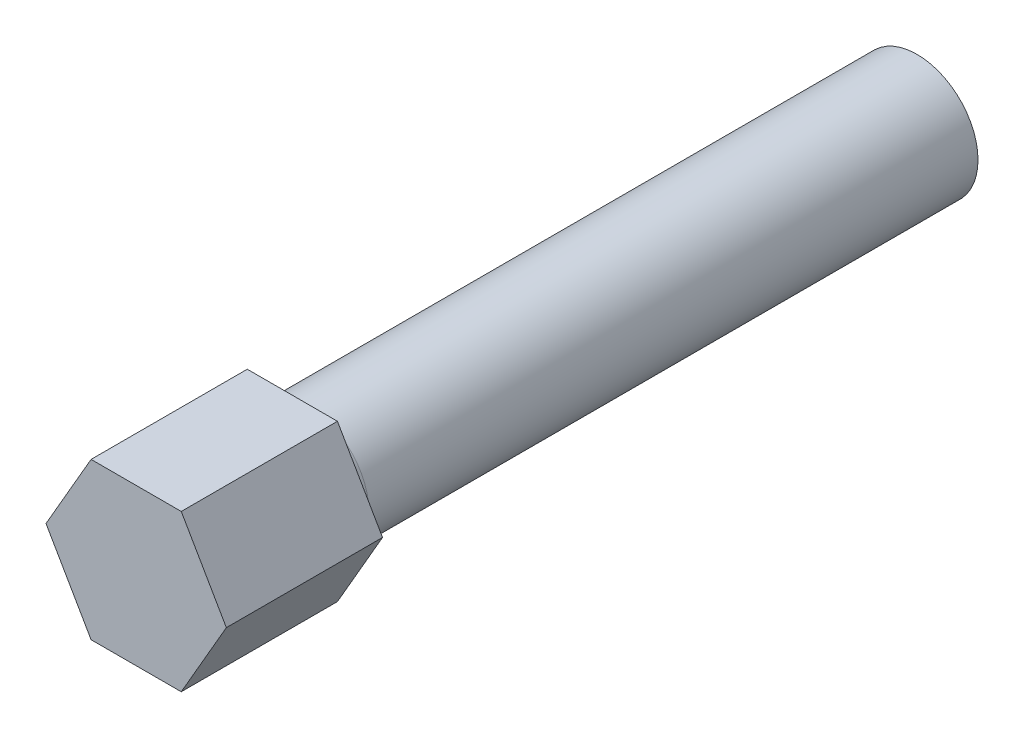
ISO-10303-21;
HEADER;
FILE_DESCRIPTION(('STEP AP214'),'2;1');
FILE_NAME('part.step','',(''),(''),'','','');
FILE_SCHEMA(('AUTOMOTIVE_DESIGN { 1 0 10303 214 1 1 1 1 }'));
ENDSEC;
DATA;
#1=APPLICATION_CONTEXT('core data for automotive mechanical design processes');
#2=APPLICATION_PROTOCOL_DEFINITION('international standard','automotive_design',2000,#1);
#3=PRODUCT_CONTEXT('',#1,'mechanical');
#4=PRODUCT('Part','Part','',(#3));
#5=PRODUCT_RELATED_PRODUCT_CATEGORY('part','',(#4));
#6=PRODUCT_DEFINITION_FORMATION('','',#4);
#7=PRODUCT_DEFINITION_CONTEXT('part definition',#1,'design');
#8=PRODUCT_DEFINITION('design','',#6,#7);
#9=PRODUCT_DEFINITION_SHAPE('','',#8);
#10=(LENGTH_UNIT() NAMED_UNIT(*) SI_UNIT(.MILLI.,.METRE.));
#11=(NAMED_UNIT(*) PLANE_ANGLE_UNIT() SI_UNIT($,.RADIAN.));
#12=(NAMED_UNIT(*) SI_UNIT($,.STERADIAN.) SOLID_ANGLE_UNIT());
#13=UNCERTAINTY_MEASURE_WITH_UNIT(LENGTH_MEASURE(1.E-05),#10,'distance_accuracy_value','');
#14=(GEOMETRIC_REPRESENTATION_CONTEXT(3) GLOBAL_UNCERTAINTY_ASSIGNED_CONTEXT((#13)) GLOBAL_UNIT_ASSIGNED_CONTEXT((#10,
#11,#12)) REPRESENTATION_CONTEXT('',''));
#15=CARTESIAN_POINT('',(0.,0.,0.));
#16=DIRECTION('',(0.,0.,1.));
#17=DIRECTION('',(1.,0.,0.));
#18=AXIS2_PLACEMENT_3D('',#15,#16,#17);
#19=CARTESIAN_POINT('',(0.,0.,50.8));
#20=DIRECTION('',(0.,0.,-1.));
#21=DIRECTION('',(-1.,0.,0.));
#22=AXIS2_PLACEMENT_3D('',#19,#20,#21);
#23=CYLINDRICAL_SURFACE('',#22,2.032);
#24=CARTESIAN_POINT('',(0.,0.,50.8));
#25=DIRECTION('',(0.,0.,1.));
#26=DIRECTION('',(1.,0.,0.));
#27=AXIS2_PLACEMENT_3D('',#24,#25,#26);
#28=CIRCLE('',#27,2.032);
#29=CARTESIAN_POINT('',(2.032,0.,50.8));
#30=VERTEX_POINT('',#29);
#31=EDGE_CURVE('E127',#30,#30,#28,.T.);
#32=ORIENTED_EDGE('',*,*,#31,.T.);
#33=EDGE_LOOP('',(#32));
#34=FACE_BOUND('',#33,.T.);
#35=CARTESIAN_POINT('',(0.,0.,3.302));
#36=DIRECTION('',(0.,0.,-1.));
#37=DIRECTION('',(-1.,0.,0.));
#38=AXIS2_PLACEMENT_3D('',#35,#36,#37);
#39=CIRCLE('',#38,2.032);
#40=CARTESIAN_POINT('',(-2.032,0.,3.302));
#41=VERTEX_POINT('',#40);
#42=EDGE_CURVE('E140',#41,#41,#39,.T.);
#43=ORIENTED_EDGE('',*,*,#42,.T.);
#44=EDGE_LOOP('',(#43));
#45=FACE_BOUND('',#44,.T.);
#46=ADVANCED_FACE('F33',(#34,#45),#23,.F.);
#47=CARTESIAN_POINT('',(0.,0.,0.));
#48=DIRECTION('',(0.,0.,1.));
#49=DIRECTION('',(1.,0.,0.));
#50=AXIS2_PLACEMENT_3D('',#47,#48,#49);
#51=PLANE('',#50);
#52=DIRECTION('',(0.5,0.866025403784438,0.));
#53=VECTOR('',#52,1.);
#54=CARTESIAN_POINT('',(-4.69270298797328,0.,0.));
#55=LINE('',#54,#53);
#56=CARTESIAN_POINT('',(-4.69270298797328,0.,0.));
#57=VERTEX_POINT('',#56);
#58=CARTESIAN_POINT('',(-2.34635149398664,4.064,0.));
#59=VERTEX_POINT('',#58);
#60=EDGE_CURVE('E126',#57,#59,#55,.T.);
#61=ORIENTED_EDGE('',*,*,#60,.F.);
#62=DIRECTION('',(-0.5,0.866025403784439,0.));
#63=VECTOR('',#62,1.);
#64=CARTESIAN_POINT('',(-2.34635149398664,-4.064,0.));
#65=LINE('',#64,#63);
#66=CARTESIAN_POINT('',(-2.34635149398664,-4.064,0.));
#67=VERTEX_POINT('',#66);
#68=EDGE_CURVE('E48',#67,#57,#65,.T.);
#69=ORIENTED_EDGE('',*,*,#68,.F.);
#70=DIRECTION('',(-1.,0.,0.));
#71=VECTOR('',#70,1.);
#72=CARTESIAN_POINT('',(2.34635149398664,-4.064,0.));
#73=LINE('',#72,#71);
#74=CARTESIAN_POINT('',(2.34635149398664,-4.064,0.));
#75=VERTEX_POINT('',#74);
#76=EDGE_CURVE('E136',#75,#67,#73,.T.);
#77=ORIENTED_EDGE('',*,*,#76,.F.);
#78=DIRECTION('',(-0.5,-0.866025403784439,0.));
#79=VECTOR('',#78,1.);
#80=CARTESIAN_POINT('',(4.69270298797328,0.,0.));
#81=LINE('',#80,#79);
#82=CARTESIAN_POINT('',(4.69270298797328,0.,0.));
#83=VERTEX_POINT('',#82);
#84=EDGE_CURVE('E134',#83,#75,#81,.T.);
#85=ORIENTED_EDGE('',*,*,#84,.F.);
#86=DIRECTION('',(0.5,-0.866025403784439,0.));
#87=VECTOR('',#86,1.);
#88=CARTESIAN_POINT('',(2.34635149398664,4.064,0.));
#89=LINE('',#88,#87);
#90=CARTESIAN_POINT('',(2.34635149398664,4.064,0.));
#91=VERTEX_POINT('',#90);
#92=EDGE_CURVE('E100',#91,#83,#89,.T.);
#93=ORIENTED_EDGE('',*,*,#92,.F.);
#94=DIRECTION('',(1.,0.,0.));
#95=VECTOR('',#94,1.);
#96=CARTESIAN_POINT('',(-2.34635149398664,4.064,0.));
#97=LINE('',#96,#95);
#98=EDGE_CURVE('E130',#59,#91,#97,.T.);
#99=ORIENTED_EDGE('',*,*,#98,.F.);
#100=EDGE_LOOP('',(#61,#69,#77,#85,#93,#99));
#101=FACE_BOUND('',#100,.T.);
#102=CARTESIAN_POINT('',(0.,0.,0.));
#103=DIRECTION('',(0.,0.,1.));
#104=DIRECTION('',(1.,0.,0.));
#105=AXIS2_PLACEMENT_3D('',#102,#103,#104);
#106=CIRCLE('',#105,4.953);
#107=CARTESIAN_POINT('',(4.953,0.,0.));
#108=VERTEX_POINT('',#107);
#109=EDGE_CURVE('E149',#108,#108,#106,.T.);
#110=ORIENTED_EDGE('',*,*,#109,.F.);
#111=EDGE_LOOP('',(#110));
#112=FACE_BOUND('',#111,.T.);
#113=ADVANCED_FACE('F169',(#101,#112),#51,.F.);
#114=CARTESIAN_POINT('',(0.,0.,50.8));
#115=DIRECTION('',(0.,0.,-1.));
#116=DIRECTION('',(-1.,0.,0.));
#117=AXIS2_PLACEMENT_3D('',#114,#115,#116);
#118=CYLINDRICAL_SURFACE('',#117,4.953);
#119=CARTESIAN_POINT('',(0.,0.,49.53));
#120=DIRECTION('',(0.,0.,1.));
#121=DIRECTION('',(1.,0.,0.));
#122=AXIS2_PLACEMENT_3D('',#119,#120,#121);
#123=CIRCLE('',#122,4.953);
#124=CARTESIAN_POINT('',(4.953,0.,49.53));
#125=VERTEX_POINT('',#124);
#126=EDGE_CURVE('E11',#125,#125,#123,.F.);
#127=ORIENTED_EDGE('',*,*,#126,.T.);
#128=EDGE_LOOP('',(#127));
#129=FACE_BOUND('',#128,.T.);
#130=ORIENTED_EDGE('',*,*,#109,.T.);
#131=EDGE_LOOP('',(#130));
#132=FACE_BOUND('',#131,.T.);
#133=ADVANCED_FACE('F175',(#129,#132),#118,.T.);
#134=CARTESIAN_POINT('',(-2.34635149398664,-4.064,3.302));
#135=DIRECTION('',(-0.866025403784439,-0.5,0.));
#136=DIRECTION('',(0.5,-0.866025403784439,0.));
#137=AXIS2_PLACEMENT_3D('',#134,#135,#136);
#138=PLANE('',#137);
#139=ORIENTED_EDGE('',*,*,#68,.T.);
#140=DIRECTION('',(0.,0.,-1.));
#141=VECTOR('',#140,1.);
#142=CARTESIAN_POINT('',(-4.69270298797328,0.,3.302));
#143=LINE('',#142,#141);
#144=CARTESIAN_POINT('',(-4.69270298797328,0.,3.302));
#145=VERTEX_POINT('',#144);
#146=EDGE_CURVE('E79',#145,#57,#143,.T.);
#147=ORIENTED_EDGE('',*,*,#146,.F.);
#148=DIRECTION('',(-0.5,0.866025403784439,0.));
#149=VECTOR('',#148,1.);
#150=CARTESIAN_POINT('',(-2.34635149398664,-4.064,3.302));
#151=LINE('',#150,#149);
#152=CARTESIAN_POINT('',(-2.34635149398664,-4.064,3.302));
#153=VERTEX_POINT('',#152);
#154=EDGE_CURVE('E138',#153,#145,#151,.T.);
#155=ORIENTED_EDGE('',*,*,#154,.F.);
#156=DIRECTION('',(0.,0.,-1.));
#157=VECTOR('',#156,1.);
#158=CARTESIAN_POINT('',(-2.34635149398664,-4.064,3.302));
#159=LINE('',#158,#157);
#160=EDGE_CURVE('E56',#153,#67,#159,.T.);
#161=ORIENTED_EDGE('',*,*,#160,.T.);
#162=EDGE_LOOP('',(#139,#147,#155,#161));
#163=FACE_BOUND('',#162,.T.);
#164=ADVANCED_FACE('F180',(#163),#138,.F.);
#165=CARTESIAN_POINT('',(2.34635149398664,-4.064,3.302));
#166=DIRECTION('',(0.,-1.,0.));
#167=DIRECTION('',(0.,0.,-1.));
#168=AXIS2_PLACEMENT_3D('',#165,#166,#167);
#169=PLANE('',#168);
#170=ORIENTED_EDGE('',*,*,#76,.T.);
#171=ORIENTED_EDGE('',*,*,#160,.F.);
#172=DIRECTION('',(-1.,0.,0.));
#173=VECTOR('',#172,1.);
#174=CARTESIAN_POINT('',(2.34635149398664,-4.064,3.302));
#175=LINE('',#174,#173);
#176=CARTESIAN_POINT('',(2.34635149398664,-4.064,3.302));
#177=VERTEX_POINT('',#176);
#178=EDGE_CURVE('E112',#177,#153,#175,.T.);
#179=ORIENTED_EDGE('',*,*,#178,.F.);
#180=DIRECTION('',(0.,0.,-1.));
#181=VECTOR('',#180,1.);
#182=CARTESIAN_POINT('',(2.34635149398664,-4.064,3.302));
#183=LINE('',#182,#181);
#184=EDGE_CURVE('E104',#177,#75,#183,.T.);
#185=ORIENTED_EDGE('',*,*,#184,.T.);
#186=EDGE_LOOP('',(#170,#171,#179,#185));
#187=FACE_BOUND('',#186,.T.);
#188=ADVANCED_FACE('F189',(#187),#169,.F.);
#189=CARTESIAN_POINT('',(4.69270298797328,0.,3.302));
#190=DIRECTION('',(0.866025403784438,-0.5,0.));
#191=DIRECTION('',(0.5,0.866025403784439,0.));
#192=AXIS2_PLACEMENT_3D('',#189,#190,#191);
#193=PLANE('',#192);
#194=ORIENTED_EDGE('',*,*,#84,.T.);
#195=ORIENTED_EDGE('',*,*,#184,.F.);
#196=DIRECTION('',(-0.5,-0.866025403784439,0.));
#197=VECTOR('',#196,1.);
#198=CARTESIAN_POINT('',(4.69270298797328,0.,3.302));
#199=LINE('',#198,#197);
#200=CARTESIAN_POINT('',(4.69270298797328,0.,3.302));
#201=VERTEX_POINT('',#200);
#202=EDGE_CURVE('E108',#201,#177,#199,.T.);
#203=ORIENTED_EDGE('',*,*,#202,.F.);
#204=DIRECTION('',(0.,0.,-1.));
#205=VECTOR('',#204,1.);
#206=CARTESIAN_POINT('',(4.69270298797328,0.,3.302));
#207=LINE('',#206,#205);
#208=EDGE_CURVE('E93',#201,#83,#207,.T.);
#209=ORIENTED_EDGE('',*,*,#208,.T.);
#210=EDGE_LOOP('',(#194,#195,#203,#209));
#211=FACE_BOUND('',#210,.T.);
#212=ADVANCED_FACE('F109',(#211),#193,.F.);
#213=CARTESIAN_POINT('',(2.34635149398664,4.064,3.302));
#214=DIRECTION('',(0.866025403784439,0.5,0.));
#215=DIRECTION('',(-0.5,0.866025403784439,0.));
#216=AXIS2_PLACEMENT_3D('',#213,#214,#215);
#217=PLANE('',#216);
#218=ORIENTED_EDGE('',*,*,#92,.T.);
#219=ORIENTED_EDGE('',*,*,#208,.F.);
#220=DIRECTION('',(0.5,-0.866025403784439,0.));
#221=VECTOR('',#220,1.);
#222=CARTESIAN_POINT('',(2.34635149398664,4.064,3.302));
#223=LINE('',#222,#221);
#224=CARTESIAN_POINT('',(2.34635149398664,4.064,3.302));
#225=VERTEX_POINT('',#224);
#226=EDGE_CURVE('E97',#225,#201,#223,.T.);
#227=ORIENTED_EDGE('',*,*,#226,.F.);
#228=DIRECTION('',(0.,0.,-1.));
#229=VECTOR('',#228,1.);
#230=CARTESIAN_POINT('',(2.34635149398664,4.064,3.302));
#231=LINE('',#230,#229);
#232=EDGE_CURVE('E105',#225,#91,#231,.T.);
#233=ORIENTED_EDGE('',*,*,#232,.T.);
#234=EDGE_LOOP('',(#218,#219,#227,#233));
#235=FACE_BOUND('',#234,.T.);
#236=ADVANCED_FACE('F95',(#235),#217,.F.);
#237=CARTESIAN_POINT('',(-2.34635149398664,4.064,3.302));
#238=DIRECTION('',(0.,1.,0.));
#239=DIRECTION('',(0.,0.,1.));
#240=AXIS2_PLACEMENT_3D('',#237,#238,#239);
#241=PLANE('',#240);
#242=ORIENTED_EDGE('',*,*,#98,.T.);
#243=ORIENTED_EDGE('',*,*,#232,.F.);
#244=DIRECTION('',(1.,0.,0.));
#245=VECTOR('',#244,1.);
#246=CARTESIAN_POINT('',(-2.34635149398664,4.064,3.302));
#247=LINE('',#246,#245);
#248=CARTESIAN_POINT('',(-2.34635149398664,4.064,3.302));
#249=VERTEX_POINT('',#248);
#250=EDGE_CURVE('E118',#249,#225,#247,.T.);
#251=ORIENTED_EDGE('',*,*,#250,.F.);
#252=DIRECTION('',(0.,0.,-1.));
#253=VECTOR('',#252,1.);
#254=CARTESIAN_POINT('',(-2.34635149398664,4.064,3.302));
#255=LINE('',#254,#253);
#256=EDGE_CURVE('E143',#249,#59,#255,.T.);
#257=ORIENTED_EDGE('',*,*,#256,.T.);
#258=EDGE_LOOP('',(#242,#243,#251,#257));
#259=FACE_BOUND('',#258,.T.);
#260=ADVANCED_FACE('F206',(#259),#241,.F.);
#261=CARTESIAN_POINT('',(-4.69270298797328,0.,3.302));
#262=DIRECTION('',(-0.866025403784438,0.5,0.));
#263=DIRECTION('',(-0.5,-0.866025403784438,0.));
#264=AXIS2_PLACEMENT_3D('',#261,#262,#263);
#265=PLANE('',#264);
#266=ORIENTED_EDGE('',*,*,#60,.T.);
#267=ORIENTED_EDGE('',*,*,#256,.F.);
#268=DIRECTION('',(0.5,0.866025403784438,0.));
#269=VECTOR('',#268,1.);
#270=CARTESIAN_POINT('',(-4.69270298797328,0.,3.302));
#271=LINE('',#270,#269);
#272=EDGE_CURVE('E120',#145,#249,#271,.T.);
#273=ORIENTED_EDGE('',*,*,#272,.F.);
#274=ORIENTED_EDGE('',*,*,#146,.T.);
#275=EDGE_LOOP('',(#266,#267,#273,#274));
#276=FACE_BOUND('',#275,.T.);
#277=ADVANCED_FACE('F208',(#276),#265,.F.);
#278=CARTESIAN_POINT('',(0.,0.,3.302));
#279=DIRECTION('',(0.,0.,-1.));
#280=DIRECTION('',(-1.,0.,0.));
#281=AXIS2_PLACEMENT_3D('',#278,#279,#280);
#282=PLANE('',#281);
#283=ORIENTED_EDGE('',*,*,#42,.F.);
#284=EDGE_LOOP('',(#283));
#285=FACE_BOUND('',#284,.T.);
#286=ORIENTED_EDGE('',*,*,#154,.T.);
#287=ORIENTED_EDGE('',*,*,#272,.T.);
#288=ORIENTED_EDGE('',*,*,#250,.T.);
#289=ORIENTED_EDGE('',*,*,#226,.T.);
#290=ORIENTED_EDGE('',*,*,#202,.T.);
#291=ORIENTED_EDGE('',*,*,#178,.T.);
#292=EDGE_LOOP('',(#286,#287,#288,#289,#290,#291));
#293=FACE_BOUND('',#292,.T.);
#294=ADVANCED_FACE('F115',(#285,#293),#282,.T.);
#295=CARTESIAN_POINT('',(0.,0.,50.8));
#296=DIRECTION('',(0.,0.,1.));
#297=DIRECTION('',(1.,0.,0.));
#298=AXIS2_PLACEMENT_3D('',#295,#296,#297);
#299=PLANE('',#298);
#300=ORIENTED_EDGE('',*,*,#31,.F.);
#301=EDGE_LOOP('',(#300));
#302=FACE_BOUND('',#301,.T.);
#303=ADVANCED_FACE('F166',(#302),#299,.F.);
#304=CARTESIAN_POINT('',(3.66617420935412,-6.35,63.5));
#305=DIRECTION('',(-0.866025403784439,0.5,0.));
#306=DIRECTION('',(-0.5,-0.866025403784439,0.));
#307=AXIS2_PLACEMENT_3D('',#304,#305,#306);
#308=PLANE('',#307);
#309=DIRECTION('',(0.5,0.866025403784439,0.));
#310=VECTOR('',#309,1.);
#311=CARTESIAN_POINT('',(3.66617420935412,-6.35,50.8));
#312=LINE('',#311,#310);
#313=CARTESIAN_POINT('',(3.66617420935412,-6.35,50.8));
#314=VERTEX_POINT('',#313);
#315=CARTESIAN_POINT('',(7.33234841870825,0.,50.8));
#316=VERTEX_POINT('',#315);
#317=EDGE_CURVE('E254',#314,#316,#312,.T.);
#318=ORIENTED_EDGE('',*,*,#317,.T.);
#319=DIRECTION('',(0.,0.,-1.));
#320=VECTOR('',#319,1.);
#321=CARTESIAN_POINT('',(7.33234841870825,0.,63.5));
#322=LINE('',#321,#320);
#323=CARTESIAN_POINT('',(7.33234841870825,0.,63.5));
#324=VERTEX_POINT('',#323);
#325=EDGE_CURVE('E148',#324,#316,#322,.T.);
#326=ORIENTED_EDGE('',*,*,#325,.F.);
#327=DIRECTION('',(0.5,0.866025403784439,0.));
#328=VECTOR('',#327,1.);
#329=CARTESIAN_POINT('',(3.66617420935412,-6.35,63.5));
#330=LINE('',#329,#328);
#331=CARTESIAN_POINT('',(3.66617420935412,-6.35,63.5));
#332=VERTEX_POINT('',#331);
#333=EDGE_CURVE('E241',#332,#324,#330,.T.);
#334=ORIENTED_EDGE('',*,*,#333,.F.);
#335=DIRECTION('',(0.,0.,-1.));
#336=VECTOR('',#335,1.);
#337=CARTESIAN_POINT('',(3.66617420935412,-6.35,63.5));
#338=LINE('',#337,#336);
#339=EDGE_CURVE('E234',#332,#314,#338,.T.);
#340=ORIENTED_EDGE('',*,*,#339,.T.);
#341=EDGE_LOOP('',(#318,#326,#334,#340));
#342=FACE_BOUND('',#341,.T.);
#343=ADVANCED_FACE('F283',(#342),#308,.F.);
#344=CARTESIAN_POINT('',(7.33234841870825,0.,63.5));
#345=DIRECTION('',(-0.866025403784439,-0.5,0.));
#346=DIRECTION('',(0.5,-0.866025403784439,0.));
#347=AXIS2_PLACEMENT_3D('',#344,#345,#346);
#348=PLANE('',#347);
#349=DIRECTION('',(-0.5,0.866025403784439,0.));
#350=VECTOR('',#349,1.);
#351=CARTESIAN_POINT('',(7.33234841870825,0.,50.8));
#352=LINE('',#351,#350);
#353=CARTESIAN_POINT('',(3.66617420935412,6.35,50.8));
#354=VERTEX_POINT('',#353);
#355=EDGE_CURVE('E251',#316,#354,#352,.T.);
#356=ORIENTED_EDGE('',*,*,#355,.T.);
#357=DIRECTION('',(0.,0.,-1.));
#358=VECTOR('',#357,1.);
#359=CARTESIAN_POINT('',(3.66617420935412,6.35,63.5));
#360=LINE('',#359,#358);
#361=CARTESIAN_POINT('',(3.66617420935412,6.35,63.5));
#362=VERTEX_POINT('',#361);
#363=EDGE_CURVE('E222',#362,#354,#360,.T.);
#364=ORIENTED_EDGE('',*,*,#363,.F.);
#365=DIRECTION('',(-0.5,0.866025403784439,0.));
#366=VECTOR('',#365,1.);
#367=CARTESIAN_POINT('',(7.33234841870825,0.,63.5));
#368=LINE('',#367,#366);
#369=EDGE_CURVE('E268',#324,#362,#368,.T.);
#370=ORIENTED_EDGE('',*,*,#369,.F.);
#371=ORIENTED_EDGE('',*,*,#325,.T.);
#372=EDGE_LOOP('',(#356,#364,#370,#371));
#373=FACE_BOUND('',#372,.T.);
#374=ADVANCED_FACE('F287',(#373),#348,.F.);
#375=CARTESIAN_POINT('',(3.66617420935412,6.35,63.5));
#376=DIRECTION('',(0.,-1.,0.));
#377=DIRECTION('',(1.,0.,0.));
#378=AXIS2_PLACEMENT_3D('',#375,#376,#377);
#379=PLANE('',#378);
#380=DIRECTION('',(-1.,0.,0.));
#381=VECTOR('',#380,1.);
#382=CARTESIAN_POINT('',(3.66617420935412,6.35,50.8));
#383=LINE('',#382,#381);
#384=CARTESIAN_POINT('',(-3.66617420935413,6.35,50.8));
#385=VERTEX_POINT('',#384);
#386=EDGE_CURVE('E248',#354,#385,#383,.T.);
#387=ORIENTED_EDGE('',*,*,#386,.T.);
#388=DIRECTION('',(0.,0.,-1.));
#389=VECTOR('',#388,1.);
#390=CARTESIAN_POINT('',(-3.66617420935413,6.35,63.5));
#391=LINE('',#390,#389);
#392=CARTESIAN_POINT('',(-3.66617420935413,6.35,63.5));
#393=VERTEX_POINT('',#392);
#394=EDGE_CURVE('E225',#393,#385,#391,.T.);
#395=ORIENTED_EDGE('',*,*,#394,.F.);
#396=DIRECTION('',(-1.,0.,0.));
#397=VECTOR('',#396,1.);
#398=CARTESIAN_POINT('',(3.66617420935412,6.35,63.5));
#399=LINE('',#398,#397);
#400=EDGE_CURVE('E265',#362,#393,#399,.T.);
#401=ORIENTED_EDGE('',*,*,#400,.F.);
#402=ORIENTED_EDGE('',*,*,#363,.T.);
#403=EDGE_LOOP('',(#387,#395,#401,#402));
#404=FACE_BOUND('',#403,.T.);
#405=ADVANCED_FACE('F322',(#404),#379,.F.);
#406=CARTESIAN_POINT('',(-3.66617420935413,6.35,63.5));
#407=DIRECTION('',(0.866025403784439,-0.5,0.));
#408=DIRECTION('',(0.5,0.866025403784439,0.));
#409=AXIS2_PLACEMENT_3D('',#406,#407,#408);
#410=PLANE('',#409);
#411=DIRECTION('',(-0.5,-0.866025403784439,0.));
#412=VECTOR('',#411,1.);
#413=CARTESIAN_POINT('',(-3.66617420935413,6.35,50.8));
#414=LINE('',#413,#412);
#415=CARTESIAN_POINT('',(-7.33234841870825,0.,50.8));
#416=VERTEX_POINT('',#415);
#417=EDGE_CURVE('E245',#385,#416,#414,.T.);
#418=ORIENTED_EDGE('',*,*,#417,.T.);
#419=DIRECTION('',(0.,0.,-1.));
#420=VECTOR('',#419,1.);
#421=CARTESIAN_POINT('',(-7.33234841870825,0.,63.5));
#422=LINE('',#421,#420);
#423=CARTESIAN_POINT('',(-7.33234841870825,0.,63.5));
#424=VERTEX_POINT('',#423);
#425=EDGE_CURVE('E228',#424,#416,#422,.T.);
#426=ORIENTED_EDGE('',*,*,#425,.F.);
#427=DIRECTION('',(-0.5,-0.866025403784439,0.));
#428=VECTOR('',#427,1.);
#429=CARTESIAN_POINT('',(-3.66617420935413,6.35,63.5));
#430=LINE('',#429,#428);
#431=EDGE_CURVE('E262',#393,#424,#430,.T.);
#432=ORIENTED_EDGE('',*,*,#431,.F.);
#433=ORIENTED_EDGE('',*,*,#394,.T.);
#434=EDGE_LOOP('',(#418,#426,#432,#433));
#435=FACE_BOUND('',#434,.T.);
#436=ADVANCED_FACE('F309',(#435),#410,.F.);
#437=CARTESIAN_POINT('',(-7.33234841870825,0.,63.5));
#438=DIRECTION('',(0.866025403784439,0.5,0.));
#439=DIRECTION('',(-0.5,0.866025403784439,0.));
#440=AXIS2_PLACEMENT_3D('',#437,#438,#439);
#441=PLANE('',#440);
#442=DIRECTION('',(0.5,-0.866025403784439,0.));
#443=VECTOR('',#442,1.);
#444=CARTESIAN_POINT('',(-7.33234841870825,0.,50.8));
#445=LINE('',#444,#443);
#446=CARTESIAN_POINT('',(-3.66617420935413,-6.35,50.8));
#447=VERTEX_POINT('',#446);
#448=EDGE_CURVE('E242',#416,#447,#445,.T.);
#449=ORIENTED_EDGE('',*,*,#448,.T.);
#450=DIRECTION('',(0.,0.,-1.));
#451=VECTOR('',#450,1.);
#452=CARTESIAN_POINT('',(-3.66617420935413,-6.35,63.5));
#453=LINE('',#452,#451);
#454=CARTESIAN_POINT('',(-3.66617420935413,-6.35,63.5));
#455=VERTEX_POINT('',#454);
#456=EDGE_CURVE('E231',#455,#447,#453,.T.);
#457=ORIENTED_EDGE('',*,*,#456,.F.);
#458=DIRECTION('',(0.5,-0.866025403784439,0.));
#459=VECTOR('',#458,1.);
#460=CARTESIAN_POINT('',(-7.33234841870825,0.,63.5));
#461=LINE('',#460,#459);
#462=EDGE_CURVE('E259',#424,#455,#461,.T.);
#463=ORIENTED_EDGE('',*,*,#462,.F.);
#464=ORIENTED_EDGE('',*,*,#425,.T.);
#465=EDGE_LOOP('',(#449,#457,#463,#464));
#466=FACE_BOUND('',#465,.T.);
#467=ADVANCED_FACE('F314',(#466),#441,.F.);
#468=CARTESIAN_POINT('',(-3.66617420935413,-6.35,63.5));
#469=DIRECTION('',(0.,1.,0.));
#470=DIRECTION('',(-1.,0.,0.));
#471=AXIS2_PLACEMENT_3D('',#468,#469,#470);
#472=PLANE('',#471);
#473=DIRECTION('',(1.,0.,0.));
#474=VECTOR('',#473,1.);
#475=CARTESIAN_POINT('',(-3.66617420935413,-6.35,50.8));
#476=LINE('',#475,#474);
#477=EDGE_CURVE('E238',#447,#314,#476,.T.);
#478=ORIENTED_EDGE('',*,*,#477,.T.);
#479=ORIENTED_EDGE('',*,*,#339,.F.);
#480=DIRECTION('',(1.,0.,0.));
#481=VECTOR('',#480,1.);
#482=CARTESIAN_POINT('',(-3.66617420935413,-6.35,63.5));
#483=LINE('',#482,#481);
#484=EDGE_CURVE('E237',#455,#332,#483,.T.);
#485=ORIENTED_EDGE('',*,*,#484,.F.);
#486=ORIENTED_EDGE('',*,*,#456,.T.);
#487=EDGE_LOOP('',(#478,#479,#485,#486));
#488=FACE_BOUND('',#487,.T.);
#489=ADVANCED_FACE('F305',(#488),#472,.F.);
#490=CARTESIAN_POINT('',(0.,0.,63.5));
#491=DIRECTION('',(0.,0.,1.));
#492=DIRECTION('',(1.,0.,0.));
#493=AXIS2_PLACEMENT_3D('',#490,#491,#492);
#494=PLANE('',#493);
#495=ORIENTED_EDGE('',*,*,#333,.T.);
#496=ORIENTED_EDGE('',*,*,#369,.T.);
#497=ORIENTED_EDGE('',*,*,#400,.T.);
#498=ORIENTED_EDGE('',*,*,#431,.T.);
#499=ORIENTED_EDGE('',*,*,#462,.T.);
#500=ORIENTED_EDGE('',*,*,#484,.T.);
#501=EDGE_LOOP('',(#495,#496,#497,#498,#499,#500));
#502=FACE_BOUND('',#501,.T.);
#503=ADVANCED_FACE('F164',(#502),#494,.T.);
#504=CARTESIAN_POINT('',(0.,0.,50.8));
#505=DIRECTION('',(0.,0.,1.));
#506=DIRECTION('',(1.,0.,0.));
#507=AXIS2_PLACEMENT_3D('',#504,#505,#506);
#508=CIRCLE('',#507,6.223);
#509=CARTESIAN_POINT('',(6.223,0.,50.8));
#510=VERTEX_POINT('',#509);
#511=EDGE_CURVE('E41',#510,#510,#508,.T.);
#512=ORIENTED_EDGE('',*,*,#511,.T.);
#513=EDGE_LOOP('',(#512));
#514=FACE_BOUND('',#513,.T.);
#515=ORIENTED_EDGE('',*,*,#317,.F.);
#516=ORIENTED_EDGE('',*,*,#477,.F.);
#517=ORIENTED_EDGE('',*,*,#448,.F.);
#518=ORIENTED_EDGE('',*,*,#417,.F.);
#519=ORIENTED_EDGE('',*,*,#386,.F.);
#520=ORIENTED_EDGE('',*,*,#355,.F.);
#521=EDGE_LOOP('',(#515,#516,#517,#518,#519,#520));
#522=FACE_BOUND('',#521,.T.);
#523=ADVANCED_FACE('F156',(#514,#522),#299,.F.);
#524=CARTESIAN_POINT('',(0.,0.,49.53));
#525=DIRECTION('',(0.,0.,1.));
#526=DIRECTION('',(1.,0.,0.));
#527=AXIS2_PLACEMENT_3D('',#524,#525,#526);
#528=TOROIDAL_SURFACE('',#527,6.223,1.27);
#529=ORIENTED_EDGE('',*,*,#126,.F.);
#530=EDGE_LOOP('',(#529));
#531=FACE_BOUND('',#530,.T.);
#532=ORIENTED_EDGE('',*,*,#511,.F.);
#533=EDGE_LOOP('',(#532));
#534=FACE_BOUND('',#533,.T.);
#535=ADVANCED_FACE('F35',(#531,#534),#528,.F.);
#536=CLOSED_SHELL('',(#46,#113,#133,#164,#188,#212,#236,#260,#277,#294,#303,#343,#374,#405,#436,
#467,#489,#503,#523,#535));
#537=MANIFOLD_SOLID_BREP('B2',#536);
#538=ADVANCED_BREP_SHAPE_REPRESENTATION('',(#18,#537),#14);
#539=SHAPE_DEFINITION_REPRESENTATION(#9,#538);
ENDSEC;
END-ISO-10303-21;
